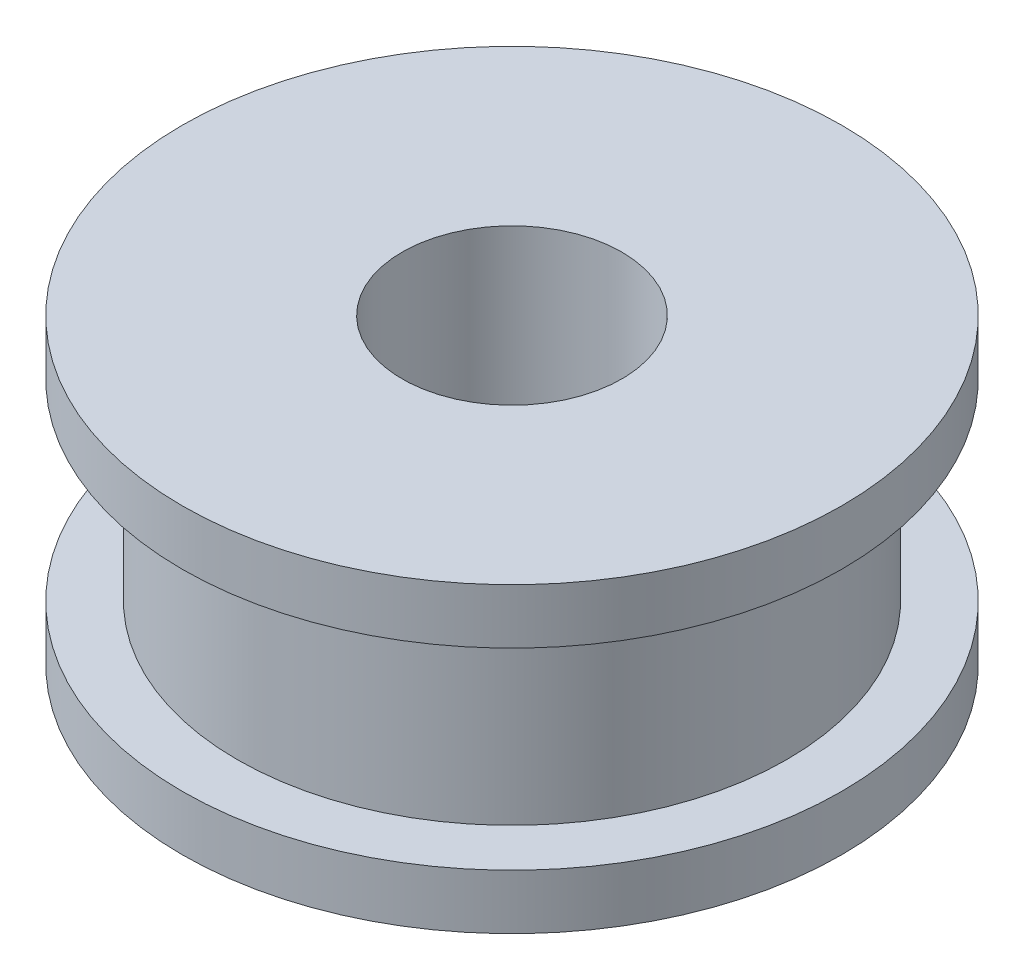
ISO-10303-21;
HEADER;
FILE_DESCRIPTION(('STEP AP214'),'2;1');
FILE_NAME('part.step','',(''),(''),'','','');
FILE_SCHEMA(('AUTOMOTIVE_DESIGN { 1 0 10303 214 1 1 1 1 }'));
ENDSEC;
DATA;
#1=APPLICATION_CONTEXT('core data for automotive mechanical design processes');
#2=APPLICATION_PROTOCOL_DEFINITION('international standard','automotive_design',2000,#1);
#3=PRODUCT_CONTEXT('',#1,'mechanical');
#4=PRODUCT('Part','Part','',(#3));
#5=PRODUCT_RELATED_PRODUCT_CATEGORY('part','',(#4));
#6=PRODUCT_DEFINITION_FORMATION('','',#4);
#7=PRODUCT_DEFINITION_CONTEXT('part definition',#1,'design');
#8=PRODUCT_DEFINITION('design','',#6,#7);
#9=PRODUCT_DEFINITION_SHAPE('','',#8);
#10=(LENGTH_UNIT() NAMED_UNIT(*) SI_UNIT(.MILLI.,.METRE.));
#11=(NAMED_UNIT(*) PLANE_ANGLE_UNIT() SI_UNIT($,.RADIAN.));
#12=(NAMED_UNIT(*) SI_UNIT($,.STERADIAN.) SOLID_ANGLE_UNIT());
#13=UNCERTAINTY_MEASURE_WITH_UNIT(LENGTH_MEASURE(1.E-05),#10,'distance_accuracy_value','');
#14=(GEOMETRIC_REPRESENTATION_CONTEXT(3) GLOBAL_UNCERTAINTY_ASSIGNED_CONTEXT((#13)) GLOBAL_UNIT_ASSIGNED_CONTEXT((#10,
#11,#12)) REPRESENTATION_CONTEXT('',''));
#15=CARTESIAN_POINT('',(0.,0.,0.));
#16=DIRECTION('',(0.,0.,1.));
#17=DIRECTION('',(1.,0.,0.));
#18=AXIS2_PLACEMENT_3D('',#15,#16,#17);
#19=CARTESIAN_POINT('',(12.,11.,0.));
#20=DIRECTION('',(0.,1.,0.));
#21=DIRECTION('',(0.,0.,1.));
#22=AXIS2_PLACEMENT_3D('',#19,#20,#21);
#23=PLANE('',#22);
#24=CARTESIAN_POINT('',(0.,11.,0.));
#25=DIRECTION('',(0.,-1.,0.));
#26=DIRECTION('',(0.,0.,-1.));
#27=AXIS2_PLACEMENT_3D('',#24,#25,#26);
#28=CIRCLE('',#27,4.);
#29=CARTESIAN_POINT('',(0.,11.,-4.));
#30=VERTEX_POINT('',#29);
#31=EDGE_CURVE('E10',#30,#30,#28,.T.);
#32=ORIENTED_EDGE('',*,*,#31,.T.);
#33=EDGE_LOOP('',(#32));
#34=FACE_BOUND('',#33,.T.);
#35=CARTESIAN_POINT('',(0.,11.,0.));
#36=DIRECTION('',(0.,-1.,0.));
#37=DIRECTION('',(0.,0.,-1.));
#38=AXIS2_PLACEMENT_3D('',#35,#36,#37);
#39=CIRCLE('',#38,12.);
#40=CARTESIAN_POINT('',(0.,11.,-12.));
#41=VERTEX_POINT('',#40);
#42=EDGE_CURVE('E78',#41,#41,#39,.T.);
#43=ORIENTED_EDGE('',*,*,#42,.F.);
#44=EDGE_LOOP('',(#43));
#45=FACE_BOUND('',#44,.T.);
#46=ADVANCED_FACE('F43',(#34,#45),#23,.T.);
#47=CARTESIAN_POINT('',(0.,0.,0.));
#48=DIRECTION('',(0.,-1.,0.));
#49=DIRECTION('',(0.,0.,-1.));
#50=AXIS2_PLACEMENT_3D('',#47,#48,#49);
#51=CYLINDRICAL_SURFACE('',#50,4.);
#52=CARTESIAN_POINT('',(0.,0.,0.));
#53=DIRECTION('',(0.,-1.,0.));
#54=DIRECTION('',(0.,0.,-1.));
#55=AXIS2_PLACEMENT_3D('',#52,#53,#54);
#56=CIRCLE('',#55,4.);
#57=CARTESIAN_POINT('',(0.,0.,-4.));
#58=VERTEX_POINT('',#57);
#59=EDGE_CURVE('E50',#58,#58,#56,.T.);
#60=ORIENTED_EDGE('',*,*,#59,.T.);
#61=EDGE_LOOP('',(#60));
#62=FACE_BOUND('',#61,.T.);
#63=ORIENTED_EDGE('',*,*,#31,.F.);
#64=EDGE_LOOP('',(#63));
#65=FACE_BOUND('',#64,.T.);
#66=ADVANCED_FACE('F87',(#62,#65),#51,.F.);
#67=CARTESIAN_POINT('',(4.,0.,0.));
#68=DIRECTION('',(0.,-1.,0.));
#69=DIRECTION('',(0.,0.,-1.));
#70=AXIS2_PLACEMENT_3D('',#67,#68,#69);
#71=PLANE('',#70);
#72=CARTESIAN_POINT('',(0.,0.,0.));
#73=DIRECTION('',(0.,-1.,0.));
#74=DIRECTION('',(0.,0.,-1.));
#75=AXIS2_PLACEMENT_3D('',#72,#73,#74);
#76=CIRCLE('',#75,12.);
#77=CARTESIAN_POINT('',(0.,0.,-12.));
#78=VERTEX_POINT('',#77);
#79=EDGE_CURVE('E55',#78,#78,#76,.T.);
#80=ORIENTED_EDGE('',*,*,#79,.T.);
#81=EDGE_LOOP('',(#80));
#82=FACE_BOUND('',#81,.T.);
#83=ORIENTED_EDGE('',*,*,#59,.F.);
#84=EDGE_LOOP('',(#83));
#85=FACE_BOUND('',#84,.T.);
#86=ADVANCED_FACE('F91',(#82,#85),#71,.T.);
#87=CARTESIAN_POINT('',(0.,0.,0.));
#88=DIRECTION('',(0.,-1.,0.));
#89=DIRECTION('',(0.,0.,-1.));
#90=AXIS2_PLACEMENT_3D('',#87,#88,#89);
#91=CYLINDRICAL_SURFACE('',#90,12.);
#92=CARTESIAN_POINT('',(0.,2.,0.));
#93=DIRECTION('',(0.,-1.,0.));
#94=DIRECTION('',(0.,0.,-1.));
#95=AXIS2_PLACEMENT_3D('',#92,#93,#94);
#96=CIRCLE('',#95,12.);
#97=CARTESIAN_POINT('',(0.,2.,-12.));
#98=VERTEX_POINT('',#97);
#99=EDGE_CURVE('E60',#98,#98,#96,.T.);
#100=ORIENTED_EDGE('',*,*,#99,.T.);
#101=EDGE_LOOP('',(#100));
#102=FACE_BOUND('',#101,.T.);
#103=ORIENTED_EDGE('',*,*,#79,.F.);
#104=EDGE_LOOP('',(#103));
#105=FACE_BOUND('',#104,.T.);
#106=ADVANCED_FACE('F95',(#102,#105),#91,.T.);
#107=CARTESIAN_POINT('',(12.,2.,0.));
#108=DIRECTION('',(0.,1.,0.));
#109=DIRECTION('',(0.,0.,1.));
#110=AXIS2_PLACEMENT_3D('',#107,#108,#109);
#111=PLANE('',#110);
#112=CARTESIAN_POINT('',(0.,2.,0.));
#113=DIRECTION('',(0.,-1.,0.));
#114=DIRECTION('',(0.,0.,-1.));
#115=AXIS2_PLACEMENT_3D('',#112,#113,#114);
#116=CIRCLE('',#115,10.);
#117=CARTESIAN_POINT('',(0.,2.,-10.));
#118=VERTEX_POINT('',#117);
#119=EDGE_CURVE('E66',#118,#118,#116,.T.);
#120=ORIENTED_EDGE('',*,*,#119,.T.);
#121=EDGE_LOOP('',(#120));
#122=FACE_BOUND('',#121,.T.);
#123=ORIENTED_EDGE('',*,*,#99,.F.);
#124=EDGE_LOOP('',(#123));
#125=FACE_BOUND('',#124,.T.);
#126=ADVANCED_FACE('F102',(#122,#125),#111,.T.);
#127=CARTESIAN_POINT('',(0.,0.,0.));
#128=DIRECTION('',(0.,-1.,0.));
#129=DIRECTION('',(0.,0.,-1.));
#130=AXIS2_PLACEMENT_3D('',#127,#128,#129);
#131=CYLINDRICAL_SURFACE('',#130,10.);
#132=CARTESIAN_POINT('',(0.,9.,0.));
#133=DIRECTION('',(0.,-1.,0.));
#134=DIRECTION('',(0.,0.,-1.));
#135=AXIS2_PLACEMENT_3D('',#132,#133,#134);
#136=CIRCLE('',#135,10.);
#137=CARTESIAN_POINT('',(0.,9.,-10.));
#138=VERTEX_POINT('',#137);
#139=EDGE_CURVE('E70',#138,#138,#136,.T.);
#140=ORIENTED_EDGE('',*,*,#139,.T.);
#141=EDGE_LOOP('',(#140));
#142=FACE_BOUND('',#141,.T.);
#143=ORIENTED_EDGE('',*,*,#119,.F.);
#144=EDGE_LOOP('',(#143));
#145=FACE_BOUND('',#144,.T.);
#146=ADVANCED_FACE('F106',(#142,#145),#131,.T.);
#147=CARTESIAN_POINT('',(10.,9.,0.));
#148=DIRECTION('',(0.,-1.,0.));
#149=DIRECTION('',(0.,0.,-1.));
#150=AXIS2_PLACEMENT_3D('',#147,#148,#149);
#151=PLANE('',#150);
#152=CARTESIAN_POINT('',(0.,9.,0.));
#153=DIRECTION('',(0.,-1.,0.));
#154=DIRECTION('',(0.,0.,-1.));
#155=AXIS2_PLACEMENT_3D('',#152,#153,#154);
#156=CIRCLE('',#155,12.);
#157=CARTESIAN_POINT('',(0.,9.,-12.));
#158=VERTEX_POINT('',#157);
#159=EDGE_CURVE('E74',#158,#158,#156,.T.);
#160=ORIENTED_EDGE('',*,*,#159,.T.);
#161=EDGE_LOOP('',(#160));
#162=FACE_BOUND('',#161,.T.);
#163=ORIENTED_EDGE('',*,*,#139,.F.);
#164=EDGE_LOOP('',(#163));
#165=FACE_BOUND('',#164,.T.);
#166=ADVANCED_FACE('F110',(#162,#165),#151,.T.);
#167=CARTESIAN_POINT('',(0.,0.,0.));
#168=DIRECTION('',(0.,-1.,0.));
#169=DIRECTION('',(0.,0.,-1.));
#170=AXIS2_PLACEMENT_3D('',#167,#168,#169);
#171=CYLINDRICAL_SURFACE('',#170,12.);
#172=ORIENTED_EDGE('',*,*,#42,.T.);
#173=EDGE_LOOP('',(#172));
#174=FACE_BOUND('',#173,.T.);
#175=ORIENTED_EDGE('',*,*,#159,.F.);
#176=EDGE_LOOP('',(#175));
#177=FACE_BOUND('',#176,.T.);
#178=ADVANCED_FACE('F83',(#174,#177),#171,.T.);
#179=CLOSED_SHELL('',(#46,#66,#86,#106,#126,#146,#166,#178));
#180=MANIFOLD_SOLID_BREP('B2',#179);
#181=ADVANCED_BREP_SHAPE_REPRESENTATION('',(#18,#180),#14);
#182=SHAPE_DEFINITION_REPRESENTATION(#9,#181);
ENDSEC;
END-ISO-10303-21;
